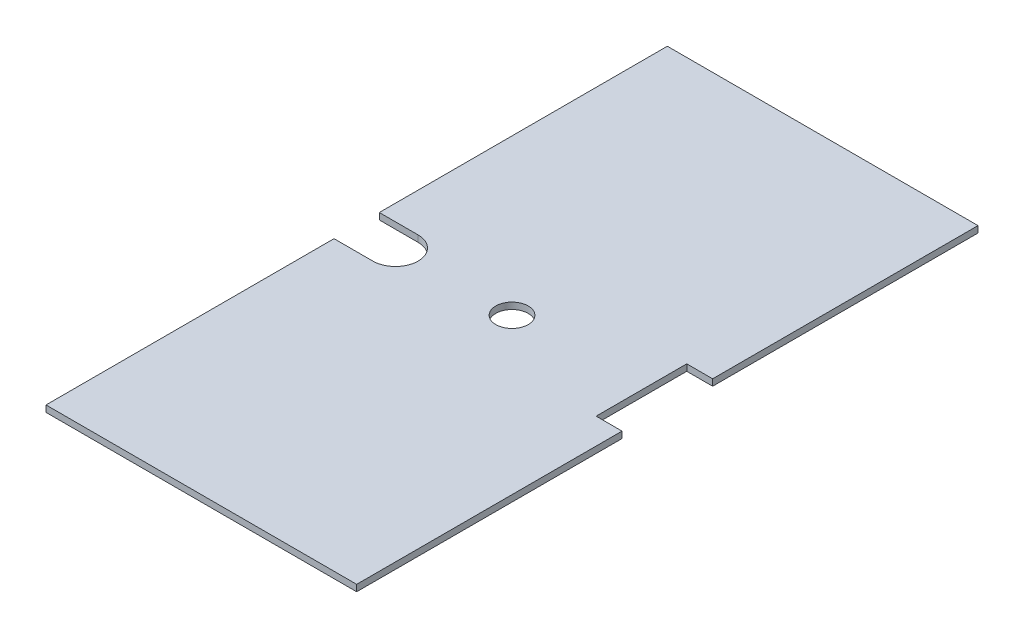
ISO-10303-21;
HEADER;
FILE_DESCRIPTION(('STEP AP214'),'2;1');
FILE_NAME('part.step','',(''),(''),'','','');
FILE_SCHEMA(('AUTOMOTIVE_DESIGN { 1 0 10303 214 1 1 1 1 }'));
ENDSEC;
DATA;
#1=APPLICATION_CONTEXT('core data for automotive mechanical design processes');
#2=APPLICATION_PROTOCOL_DEFINITION('international standard','automotive_design',2000,#1);
#3=PRODUCT_CONTEXT('',#1,'mechanical');
#4=PRODUCT('Part','Part','',(#3));
#5=PRODUCT_RELATED_PRODUCT_CATEGORY('part','',(#4));
#6=PRODUCT_DEFINITION_FORMATION('','',#4);
#7=PRODUCT_DEFINITION_CONTEXT('part definition',#1,'design');
#8=PRODUCT_DEFINITION('design','',#6,#7);
#9=PRODUCT_DEFINITION_SHAPE('','',#8);
#10=(LENGTH_UNIT() NAMED_UNIT(*) SI_UNIT(.MILLI.,.METRE.));
#11=(NAMED_UNIT(*) PLANE_ANGLE_UNIT() SI_UNIT($,.RADIAN.));
#12=(NAMED_UNIT(*) SI_UNIT($,.STERADIAN.) SOLID_ANGLE_UNIT());
#13=UNCERTAINTY_MEASURE_WITH_UNIT(LENGTH_MEASURE(1.E-05),#10,'distance_accuracy_value','');
#14=(GEOMETRIC_REPRESENTATION_CONTEXT(3) GLOBAL_UNCERTAINTY_ASSIGNED_CONTEXT((#13)) GLOBAL_UNIT_ASSIGNED_CONTEXT((#10,
#11,#12)) REPRESENTATION_CONTEXT('',''));
#15=CARTESIAN_POINT('',(0.,0.,0.));
#16=DIRECTION('',(0.,0.,1.));
#17=DIRECTION('',(1.,0.,0.));
#18=AXIS2_PLACEMENT_3D('',#15,#16,#17);
#19=CARTESIAN_POINT('',(-304.8,12.7,-609.6));
#20=DIRECTION('',(1.,0.,0.));
#21=DIRECTION('',(0.,0.,-1.));
#22=AXIS2_PLACEMENT_3D('',#19,#20,#21);
#23=PLANE('',#22);
#24=DIRECTION('',(0.,0.,1.));
#25=VECTOR('',#24,1.);
#26=CARTESIAN_POINT('',(-304.8,12.7,-609.6));
#27=LINE('',#26,#25);
#28=CARTESIAN_POINT('',(-304.8,12.7,44.45));
#29=VERTEX_POINT('',#28);
#30=CARTESIAN_POINT('',(-304.8,12.7,609.6));
#31=VERTEX_POINT('',#30);
#32=EDGE_CURVE('E186',#29,#31,#27,.T.);
#33=ORIENTED_EDGE('',*,*,#32,.F.);
#34=DIRECTION('',(0.,-1.,0.));
#35=VECTOR('',#34,1.);
#36=CARTESIAN_POINT('',(-304.8,12.7,44.45));
#37=LINE('',#36,#35);
#38=CARTESIAN_POINT('',(-304.8,0.,44.45));
#39=VERTEX_POINT('',#38);
#40=EDGE_CURVE('E146',#29,#39,#37,.T.);
#41=ORIENTED_EDGE('',*,*,#40,.T.);
#42=DIRECTION('',(0.,0.,1.));
#43=VECTOR('',#42,1.);
#44=CARTESIAN_POINT('',(-304.8,0.,-609.6));
#45=LINE('',#44,#43);
#46=CARTESIAN_POINT('',(-304.8,0.,609.6));
#47=VERTEX_POINT('',#46);
#48=EDGE_CURVE('E180',#39,#47,#45,.T.);
#49=ORIENTED_EDGE('',*,*,#48,.T.);
#50=DIRECTION('',(0.,-1.,0.));
#51=VECTOR('',#50,1.);
#52=CARTESIAN_POINT('',(-304.8,12.7,609.6));
#53=LINE('',#52,#51);
#54=EDGE_CURVE('E214',#31,#47,#53,.T.);
#55=ORIENTED_EDGE('',*,*,#54,.F.);
#56=EDGE_LOOP('',(#33,#41,#49,#55));
#57=FACE_BOUND('',#56,.T.);
#58=ADVANCED_FACE('F33',(#57),#23,.F.);
#59=CARTESIAN_POINT('',(304.8,12.7,-609.6));
#60=DIRECTION('',(-1.,0.,0.));
#61=DIRECTION('',(0.,0.,1.));
#62=AXIS2_PLACEMENT_3D('',#59,#60,#61);
#63=PLANE('',#62);
#64=DIRECTION('',(0.,0.,-1.));
#65=VECTOR('',#64,1.);
#66=CARTESIAN_POINT('',(304.8,0.,-609.6));
#67=LINE('',#66,#65);
#68=CARTESIAN_POINT('',(304.8,0.,609.6));
#69=VERTEX_POINT('',#68);
#70=CARTESIAN_POINT('',(304.8,0.,88.8999999999999));
#71=VERTEX_POINT('',#70);
#72=EDGE_CURVE('E201',#69,#71,#67,.T.);
#73=ORIENTED_EDGE('',*,*,#72,.T.);
#74=DIRECTION('',(0.,1.,0.));
#75=VECTOR('',#74,1.);
#76=CARTESIAN_POINT('',(304.8,12.7,88.9));
#77=LINE('',#76,#75);
#78=CARTESIAN_POINT('',(304.8,12.7,88.8999999999999));
#79=VERTEX_POINT('',#78);
#80=EDGE_CURVE('E173',#71,#79,#77,.T.);
#81=ORIENTED_EDGE('',*,*,#80,.T.);
#82=DIRECTION('',(0.,0.,-1.));
#83=VECTOR('',#82,1.);
#84=CARTESIAN_POINT('',(304.8,12.7,-609.6));
#85=LINE('',#84,#83);
#86=CARTESIAN_POINT('',(304.8,12.7,609.6));
#87=VERTEX_POINT('',#86);
#88=EDGE_CURVE('E189',#87,#79,#85,.T.);
#89=ORIENTED_EDGE('',*,*,#88,.F.);
#90=DIRECTION('',(0.,-1.,0.));
#91=VECTOR('',#90,1.);
#92=CARTESIAN_POINT('',(304.8,12.7,609.6));
#93=LINE('',#92,#91);
#94=EDGE_CURVE('E211',#87,#69,#93,.T.);
#95=ORIENTED_EDGE('',*,*,#94,.T.);
#96=EDGE_LOOP('',(#73,#81,#89,#95));
#97=FACE_BOUND('',#96,.T.);
#98=ADVANCED_FACE('F238',(#97),#63,.F.);
#99=CARTESIAN_POINT('',(-304.8,0.,-609.6));
#100=VERTEX_POINT('',#99);
#101=CARTESIAN_POINT('',(-304.8,0.,-44.4500000000002));
#102=VERTEX_POINT('',#101);
#103=EDGE_CURVE('E195',#100,#102,#45,.T.);
#104=ORIENTED_EDGE('',*,*,#103,.T.);
#105=DIRECTION('',(0.,1.,0.));
#106=VECTOR('',#105,1.);
#107=CARTESIAN_POINT('',(-304.8,12.7,-44.45));
#108=LINE('',#107,#106);
#109=CARTESIAN_POINT('',(-304.8,12.7,-44.45));
#110=VERTEX_POINT('',#109);
#111=EDGE_CURVE('E48',#102,#110,#108,.T.);
#112=ORIENTED_EDGE('',*,*,#111,.T.);
#113=CARTESIAN_POINT('',(-304.8,12.7,-609.6));
#114=VERTEX_POINT('',#113);
#115=EDGE_CURVE('E183',#114,#110,#27,.T.);
#116=ORIENTED_EDGE('',*,*,#115,.F.);
#117=DIRECTION('',(0.,-1.,0.));
#118=VECTOR('',#117,1.);
#119=CARTESIAN_POINT('',(-304.8,12.7,-609.6));
#120=LINE('',#119,#118);
#121=EDGE_CURVE('E194',#114,#100,#120,.T.);
#122=ORIENTED_EDGE('',*,*,#121,.T.);
#123=EDGE_LOOP('',(#104,#112,#116,#122));
#124=FACE_BOUND('',#123,.T.);
#125=ADVANCED_FACE('F35',(#124),#23,.F.);
#126=CARTESIAN_POINT('',(-304.8,12.7,609.6));
#127=DIRECTION('',(0.,0.,-1.));
#128=DIRECTION('',(-1.,0.,0.));
#129=AXIS2_PLACEMENT_3D('',#126,#127,#128);
#130=PLANE('',#129);
#131=DIRECTION('',(1.,0.,0.));
#132=VECTOR('',#131,1.);
#133=CARTESIAN_POINT('',(-304.8,0.,609.6));
#134=LINE('',#133,#132);
#135=EDGE_CURVE('E198',#47,#69,#134,.T.);
#136=ORIENTED_EDGE('',*,*,#135,.T.);
#137=ORIENTED_EDGE('',*,*,#94,.F.);
#138=DIRECTION('',(1.,0.,0.));
#139=VECTOR('',#138,1.);
#140=CARTESIAN_POINT('',(-304.8,12.7,609.6));
#141=LINE('',#140,#139);
#142=EDGE_CURVE('E185',#31,#87,#141,.T.);
#143=ORIENTED_EDGE('',*,*,#142,.F.);
#144=ORIENTED_EDGE('',*,*,#54,.T.);
#145=EDGE_LOOP('',(#136,#137,#143,#144));
#146=FACE_BOUND('',#145,.T.);
#147=ADVANCED_FACE('F246',(#146),#130,.F.);
#148=CARTESIAN_POINT('',(304.8,12.7,-88.8999999999999));
#149=VERTEX_POINT('',#148);
#150=CARTESIAN_POINT('',(304.8,12.7,-609.6));
#151=VERTEX_POINT('',#150);
#152=EDGE_CURVE('E188',#149,#151,#85,.T.);
#153=ORIENTED_EDGE('',*,*,#152,.F.);
#154=DIRECTION('',(0.,-1.,0.));
#155=VECTOR('',#154,1.);
#156=CARTESIAN_POINT('',(304.8,12.7,-88.9));
#157=LINE('',#156,#155);
#158=CARTESIAN_POINT('',(304.8,0.,-88.8999999999999));
#159=VERTEX_POINT('',#158);
#160=EDGE_CURVE('E169',#149,#159,#157,.T.);
#161=ORIENTED_EDGE('',*,*,#160,.T.);
#162=CARTESIAN_POINT('',(304.8,0.,-609.6));
#163=VERTEX_POINT('',#162);
#164=EDGE_CURVE('E200',#159,#163,#67,.T.);
#165=ORIENTED_EDGE('',*,*,#164,.T.);
#166=DIRECTION('',(0.,-1.,0.));
#167=VECTOR('',#166,1.);
#168=CARTESIAN_POINT('',(304.8,12.7,-609.6));
#169=LINE('',#168,#167);
#170=EDGE_CURVE('E208',#151,#163,#169,.T.);
#171=ORIENTED_EDGE('',*,*,#170,.F.);
#172=EDGE_LOOP('',(#153,#161,#165,#171));
#173=FACE_BOUND('',#172,.T.);
#174=ADVANCED_FACE('F226',(#173),#63,.F.);
#175=CARTESIAN_POINT('',(-304.8,12.7,-609.6));
#176=DIRECTION('',(0.,0.,1.));
#177=DIRECTION('',(1.,0.,0.));
#178=AXIS2_PLACEMENT_3D('',#175,#176,#177);
#179=PLANE('',#178);
#180=DIRECTION('',(-1.,0.,0.));
#181=VECTOR('',#180,1.);
#182=CARTESIAN_POINT('',(-304.8,0.,-609.6));
#183=LINE('',#182,#181);
#184=EDGE_CURVE('E204',#163,#100,#183,.T.);
#185=ORIENTED_EDGE('',*,*,#184,.T.);
#186=ORIENTED_EDGE('',*,*,#121,.F.);
#187=DIRECTION('',(-1.,0.,0.));
#188=VECTOR('',#187,1.);
#189=CARTESIAN_POINT('',(-304.8,12.7,-609.6));
#190=LINE('',#189,#188);
#191=EDGE_CURVE('E192',#151,#114,#190,.T.);
#192=ORIENTED_EDGE('',*,*,#191,.F.);
#193=ORIENTED_EDGE('',*,*,#170,.T.);
#194=EDGE_LOOP('',(#185,#186,#192,#193));
#195=FACE_BOUND('',#194,.T.);
#196=ADVANCED_FACE('F282',(#195),#179,.F.);
#197=CARTESIAN_POINT('',(-304.8,12.7,609.6));
#198=DIRECTION('',(0.,1.,0.));
#199=DIRECTION('',(0.,0.,1.));
#200=AXIS2_PLACEMENT_3D('',#197,#198,#199);
#201=PLANE('',#200);
#202=CARTESIAN_POINT('',(-228.599999999999,12.7,0.));
#203=DIRECTION('',(0.,1.,0.));
#204=DIRECTION('',(0.,0.,1.));
#205=AXIS2_PLACEMENT_3D('',#202,#203,#204);
#206=CIRCLE('',#205,44.45);
#207=CARTESIAN_POINT('',(-228.599999999999,12.7,44.45));
#208=VERTEX_POINT('',#207);
#209=CARTESIAN_POINT('',(-228.599999999999,12.7,-44.45));
#210=VERTEX_POINT('',#209);
#211=EDGE_CURVE('E126',#208,#210,#206,.T.);
#212=ORIENTED_EDGE('',*,*,#211,.F.);
#213=DIRECTION('',(1.,0.,0.));
#214=VECTOR('',#213,1.);
#215=CARTESIAN_POINT('',(-228.599999999999,12.7,44.45));
#216=LINE('',#215,#214);
#217=EDGE_CURVE('E139',#29,#208,#216,.T.);
#218=ORIENTED_EDGE('',*,*,#217,.F.);
#219=ORIENTED_EDGE('',*,*,#32,.T.);
#220=ORIENTED_EDGE('',*,*,#142,.T.);
#221=ORIENTED_EDGE('',*,*,#88,.T.);
#222=DIRECTION('',(1.,0.,0.));
#223=VECTOR('',#222,1.);
#224=CARTESIAN_POINT('',(669.926094715741,12.7,88.9));
#225=LINE('',#224,#223);
#226=CARTESIAN_POINT('',(254.000000000044,12.7,88.8999999999999));
#227=VERTEX_POINT('',#226);
#228=EDGE_CURVE('E158',#227,#79,#225,.T.);
#229=ORIENTED_EDGE('',*,*,#228,.F.);
#230=DIRECTION('',(0.,0.,1.));
#231=VECTOR('',#230,1.);
#232=CARTESIAN_POINT('',(254.000000000044,12.7,-88.8999999999999));
#233=LINE('',#232,#231);
#234=CARTESIAN_POINT('',(254.000000000044,12.7,-88.8999999999999));
#235=VERTEX_POINT('',#234);
#236=EDGE_CURVE('E163',#235,#227,#233,.T.);
#237=ORIENTED_EDGE('',*,*,#236,.F.);
#238=DIRECTION('',(-1.,0.,0.));
#239=VECTOR('',#238,1.);
#240=CARTESIAN_POINT('',(669.926094715741,12.7,-88.9));
#241=LINE('',#240,#239);
#242=EDGE_CURVE('E155',#149,#235,#241,.T.);
#243=ORIENTED_EDGE('',*,*,#242,.F.);
#244=ORIENTED_EDGE('',*,*,#152,.T.);
#245=ORIENTED_EDGE('',*,*,#191,.T.);
#246=ORIENTED_EDGE('',*,*,#115,.T.);
#247=DIRECTION('',(-1.,0.,0.));
#248=VECTOR('',#247,1.);
#249=CARTESIAN_POINT('',(-228.599999999999,12.7,-44.45));
#250=LINE('',#249,#248);
#251=EDGE_CURVE('E142',#210,#110,#250,.T.);
#252=ORIENTED_EDGE('',*,*,#251,.F.);
#253=EDGE_LOOP('',(#212,#218,#219,#220,#221,#229,#237,#243,#244,#245,#246,#252));
#254=FACE_BOUND('',#253,.T.);
#255=CARTESIAN_POINT('',(4.39093206239249E-11,12.7,1.35830812987789E-11));
#256=DIRECTION('',(0.,1.,0.));
#257=DIRECTION('',(0.,0.,1.));
#258=AXIS2_PLACEMENT_3D('',#255,#256,#257);
#259=CIRCLE('',#258,31.75);
#260=CARTESIAN_POINT('',(4.39093206239249E-11,12.7,31.7500000000136));
#261=VERTEX_POINT('',#260);
#262=EDGE_CURVE('E176',#261,#261,#259,.T.);
#263=ORIENTED_EDGE('',*,*,#262,.F.);
#264=EDGE_LOOP('',(#263));
#265=FACE_BOUND('',#264,.T.);
#266=ADVANCED_FACE('F137',(#254,#265),#201,.T.);
#267=CARTESIAN_POINT('',(-304.8,0.,609.6));
#268=DIRECTION('',(0.,1.,0.));
#269=DIRECTION('',(0.,0.,1.));
#270=AXIS2_PLACEMENT_3D('',#267,#268,#269);
#271=PLANE('',#270);
#272=CARTESIAN_POINT('',(4.39093206239249E-11,0.,1.35830812987789E-11));
#273=DIRECTION('',(0.,1.,0.));
#274=DIRECTION('',(0.,0.,1.));
#275=AXIS2_PLACEMENT_3D('',#272,#273,#274);
#276=CIRCLE('',#275,31.75);
#277=CARTESIAN_POINT('',(4.39093206239249E-11,0.,31.7500000000136));
#278=VERTEX_POINT('',#277);
#279=EDGE_CURVE('E177',#278,#278,#276,.T.);
#280=ORIENTED_EDGE('',*,*,#279,.T.);
#281=EDGE_LOOP('',(#280));
#282=FACE_BOUND('',#281,.T.);
#283=DIRECTION('',(1.,0.,0.));
#284=VECTOR('',#283,1.);
#285=CARTESIAN_POINT('',(-304.8,0.,44.45));
#286=LINE('',#285,#284);
#287=CARTESIAN_POINT('',(-228.599999999999,0.,44.45));
#288=VERTEX_POINT('',#287);
#289=EDGE_CURVE('E11',#39,#288,#286,.T.);
#290=ORIENTED_EDGE('',*,*,#289,.T.);
#291=CARTESIAN_POINT('',(-228.599999999999,0.,0.));
#292=DIRECTION('',(0.,1.,0.));
#293=DIRECTION('',(0.,0.,1.));
#294=AXIS2_PLACEMENT_3D('',#291,#292,#293);
#295=CIRCLE('',#294,44.45);
#296=CARTESIAN_POINT('',(-228.599999999999,0.,-44.45));
#297=VERTEX_POINT('',#296);
#298=EDGE_CURVE('E129',#288,#297,#295,.T.);
#299=ORIENTED_EDGE('',*,*,#298,.T.);
#300=DIRECTION('',(-1.,0.,0.));
#301=VECTOR('',#300,1.);
#302=CARTESIAN_POINT('',(-228.599999999999,0.,-44.45));
#303=LINE('',#302,#301);
#304=EDGE_CURVE('E147',#297,#102,#303,.T.);
#305=ORIENTED_EDGE('',*,*,#304,.T.);
#306=ORIENTED_EDGE('',*,*,#103,.F.);
#307=ORIENTED_EDGE('',*,*,#184,.F.);
#308=ORIENTED_EDGE('',*,*,#164,.F.);
#309=DIRECTION('',(-1.,0.,0.));
#310=VECTOR('',#309,1.);
#311=CARTESIAN_POINT('',(-304.8,0.,-88.8999999999999));
#312=LINE('',#311,#310);
#313=CARTESIAN_POINT('',(254.000000000044,0.,-88.8999999999999));
#314=VERTEX_POINT('',#313);
#315=EDGE_CURVE('E41',#159,#314,#312,.T.);
#316=ORIENTED_EDGE('',*,*,#315,.T.);
#317=DIRECTION('',(0.,0.,1.));
#318=VECTOR('',#317,1.);
#319=CARTESIAN_POINT('',(254.000000000044,0.,-88.8999999999999));
#320=LINE('',#319,#318);
#321=CARTESIAN_POINT('',(254.000000000044,0.,88.8999999999999));
#322=VERTEX_POINT('',#321);
#323=EDGE_CURVE('E56',#314,#322,#320,.T.);
#324=ORIENTED_EDGE('',*,*,#323,.T.);
#325=DIRECTION('',(1.,0.,0.));
#326=VECTOR('',#325,1.);
#327=CARTESIAN_POINT('',(669.926094715741,0.,88.9));
#328=LINE('',#327,#326);
#329=EDGE_CURVE('E157',#322,#71,#328,.T.);
#330=ORIENTED_EDGE('',*,*,#329,.T.);
#331=ORIENTED_EDGE('',*,*,#72,.F.);
#332=ORIENTED_EDGE('',*,*,#135,.F.);
#333=ORIENTED_EDGE('',*,*,#48,.F.);
#334=EDGE_LOOP('',(#290,#299,#305,#306,#307,#308,#316,#324,#330,#331,#332,#333));
#335=FACE_BOUND('',#334,.T.);
#336=ADVANCED_FACE('F219',(#282,#335),#271,.F.);
#337=CARTESIAN_POINT('',(4.39093206239249E-11,0.,1.35830812987789E-11));
#338=DIRECTION('',(0.,1.,0.));
#339=DIRECTION('',(0.,0.,1.));
#340=AXIS2_PLACEMENT_3D('',#337,#338,#339);
#341=CYLINDRICAL_SURFACE('',#340,31.75);
#342=ORIENTED_EDGE('',*,*,#279,.F.);
#343=EDGE_LOOP('',(#342));
#344=FACE_BOUND('',#343,.T.);
#345=ORIENTED_EDGE('',*,*,#262,.T.);
#346=EDGE_LOOP('',(#345));
#347=FACE_BOUND('',#346,.T.);
#348=ADVANCED_FACE('F272',(#344,#347),#341,.F.);
#349=CARTESIAN_POINT('',(669.926094715741,0.,88.9));
#350=DIRECTION('',(0.,0.,1.));
#351=DIRECTION('',(1.,0.,0.));
#352=AXIS2_PLACEMENT_3D('',#349,#350,#351);
#353=PLANE('',#352);
#354=ORIENTED_EDGE('',*,*,#329,.F.);
#355=DIRECTION('',(0.,1.,0.));
#356=VECTOR('',#355,1.);
#357=CARTESIAN_POINT('',(254.000000000044,0.,88.8999999999999));
#358=LINE('',#357,#356);
#359=EDGE_CURVE('E167',#322,#227,#358,.T.);
#360=ORIENTED_EDGE('',*,*,#359,.T.);
#361=ORIENTED_EDGE('',*,*,#228,.T.);
#362=ORIENTED_EDGE('',*,*,#80,.F.);
#363=EDGE_LOOP('',(#354,#360,#361,#362));
#364=FACE_BOUND('',#363,.T.);
#365=ADVANCED_FACE('F236',(#364),#353,.F.);
#366=CARTESIAN_POINT('',(669.926094715741,0.,-88.9));
#367=DIRECTION('',(0.,0.,-1.));
#368=DIRECTION('',(-1.,0.,0.));
#369=AXIS2_PLACEMENT_3D('',#366,#367,#368);
#370=PLANE('',#369);
#371=ORIENTED_EDGE('',*,*,#242,.T.);
#372=DIRECTION('',(0.,1.,0.));
#373=VECTOR('',#372,1.);
#374=CARTESIAN_POINT('',(254.000000000044,0.,-88.8999999999999));
#375=LINE('',#374,#373);
#376=EDGE_CURVE('E161',#314,#235,#375,.T.);
#377=ORIENTED_EDGE('',*,*,#376,.F.);
#378=ORIENTED_EDGE('',*,*,#315,.F.);
#379=ORIENTED_EDGE('',*,*,#160,.F.);
#380=EDGE_LOOP('',(#371,#377,#378,#379));
#381=FACE_BOUND('',#380,.T.);
#382=ADVANCED_FACE('F222',(#381),#370,.F.);
#383=CARTESIAN_POINT('',(254.000000000044,0.,-88.8999999999999));
#384=DIRECTION('',(-1.,0.,0.));
#385=DIRECTION('',(0.,0.,1.));
#386=AXIS2_PLACEMENT_3D('',#383,#384,#385);
#387=PLANE('',#386);
#388=ORIENTED_EDGE('',*,*,#236,.T.);
#389=ORIENTED_EDGE('',*,*,#359,.F.);
#390=ORIENTED_EDGE('',*,*,#323,.F.);
#391=ORIENTED_EDGE('',*,*,#376,.T.);
#392=EDGE_LOOP('',(#388,#389,#390,#391));
#393=FACE_BOUND('',#392,.T.);
#394=ADVANCED_FACE('F232',(#393),#387,.F.);
#395=CARTESIAN_POINT('',(-228.599999999999,0.,44.45));
#396=DIRECTION('',(0.,0.,1.));
#397=DIRECTION('',(1.,0.,0.));
#398=AXIS2_PLACEMENT_3D('',#395,#396,#397);
#399=PLANE('',#398);
#400=ORIENTED_EDGE('',*,*,#217,.T.);
#401=DIRECTION('',(0.,1.,0.));
#402=VECTOR('',#401,1.);
#403=CARTESIAN_POINT('',(-228.599999999999,0.,44.45));
#404=LINE('',#403,#402);
#405=EDGE_CURVE('E123',#288,#208,#404,.T.);
#406=ORIENTED_EDGE('',*,*,#405,.F.);
#407=ORIENTED_EDGE('',*,*,#289,.F.);
#408=ORIENTED_EDGE('',*,*,#40,.F.);
#409=EDGE_LOOP('',(#400,#406,#407,#408));
#410=FACE_BOUND('',#409,.T.);
#411=ADVANCED_FACE('F144',(#410),#399,.F.);
#412=CARTESIAN_POINT('',(-228.599999999999,0.,-44.45));
#413=DIRECTION('',(0.,0.,-1.));
#414=DIRECTION('',(-1.,0.,0.));
#415=AXIS2_PLACEMENT_3D('',#412,#413,#414);
#416=PLANE('',#415);
#417=ORIENTED_EDGE('',*,*,#304,.F.);
#418=DIRECTION('',(0.,1.,0.));
#419=VECTOR('',#418,1.);
#420=CARTESIAN_POINT('',(-228.599999999999,0.,-44.45));
#421=LINE('',#420,#419);
#422=EDGE_CURVE('E132',#297,#210,#421,.T.);
#423=ORIENTED_EDGE('',*,*,#422,.T.);
#424=ORIENTED_EDGE('',*,*,#251,.T.);
#425=ORIENTED_EDGE('',*,*,#111,.F.);
#426=EDGE_LOOP('',(#417,#423,#424,#425));
#427=FACE_BOUND('',#426,.T.);
#428=ADVANCED_FACE('F260',(#427),#416,.F.);
#429=CARTESIAN_POINT('',(-228.599999999999,0.,0.));
#430=DIRECTION('',(0.,1.,0.));
#431=DIRECTION('',(0.,0.,1.));
#432=AXIS2_PLACEMENT_3D('',#429,#430,#431);
#433=CYLINDRICAL_SURFACE('',#432,44.45);
#434=ORIENTED_EDGE('',*,*,#298,.F.);
#435=ORIENTED_EDGE('',*,*,#405,.T.);
#436=ORIENTED_EDGE('',*,*,#211,.T.);
#437=ORIENTED_EDGE('',*,*,#422,.F.);
#438=EDGE_LOOP('',(#434,#435,#436,#437));
#439=FACE_BOUND('',#438,.T.);
#440=ADVANCED_FACE('F125',(#439),#433,.F.);
#441=CLOSED_SHELL('',(#58,#98,#125,#147,#174,#196,#266,#336,#348,#365,#382,#394,#411,#428,#440));
#442=MANIFOLD_SOLID_BREP('B2',#441);
#443=ADVANCED_BREP_SHAPE_REPRESENTATION('',(#18,#442),#14);
#444=SHAPE_DEFINITION_REPRESENTATION(#9,#443);
ENDSEC;
END-ISO-10303-21;
